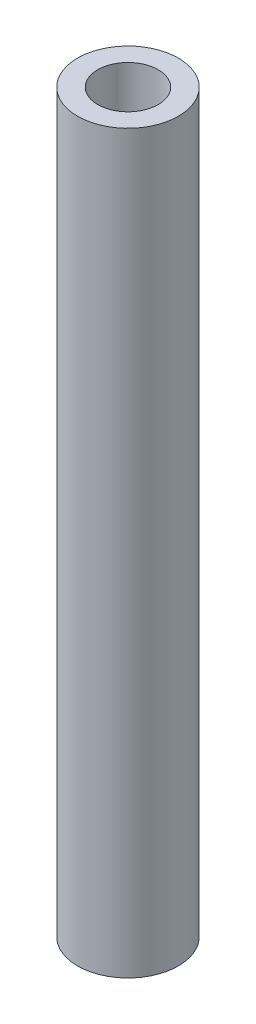
ISO-10303-21;
HEADER;
FILE_DESCRIPTION(('STEP AP214'),'2;1');
FILE_NAME('part.step','',(''),(''),'','','');
FILE_SCHEMA(('AUTOMOTIVE_DESIGN { 1 0 10303 214 1 1 1 1 }'));
ENDSEC;
DATA;
#1=APPLICATION_CONTEXT('core data for automotive mechanical design processes');
#2=APPLICATION_PROTOCOL_DEFINITION('international standard','automotive_design',2000,#1);
#3=PRODUCT_CONTEXT('',#1,'mechanical');
#4=PRODUCT('Part','Part','',(#3));
#5=PRODUCT_RELATED_PRODUCT_CATEGORY('part','',(#4));
#6=PRODUCT_DEFINITION_FORMATION('','',#4);
#7=PRODUCT_DEFINITION_CONTEXT('part definition',#1,'design');
#8=PRODUCT_DEFINITION('design','',#6,#7);
#9=PRODUCT_DEFINITION_SHAPE('','',#8);
#10=(LENGTH_UNIT() NAMED_UNIT(*) SI_UNIT(.MILLI.,.METRE.));
#11=(NAMED_UNIT(*) PLANE_ANGLE_UNIT() SI_UNIT($,.RADIAN.));
#12=(NAMED_UNIT(*) SI_UNIT($,.STERADIAN.) SOLID_ANGLE_UNIT());
#13=UNCERTAINTY_MEASURE_WITH_UNIT(LENGTH_MEASURE(1.E-05),#10,'distance_accuracy_value','');
#14=(GEOMETRIC_REPRESENTATION_CONTEXT(3) GLOBAL_UNCERTAINTY_ASSIGNED_CONTEXT((#13)) GLOBAL_UNIT_ASSIGNED_CONTEXT((#10,
#11,#12)) REPRESENTATION_CONTEXT('',''));
#15=CARTESIAN_POINT('',(0.,0.,0.));
#16=DIRECTION('',(0.,0.,1.));
#17=DIRECTION('',(1.,0.,0.));
#18=AXIS2_PLACEMENT_3D('',#15,#16,#17);
#19=CARTESIAN_POINT('',(0.,73.,0.));
#20=DIRECTION('',(0.,1.,0.));
#21=DIRECTION('',(0.,0.,1.));
#22=AXIS2_PLACEMENT_3D('',#19,#20,#21);
#23=PLANE('',#22);
#24=CARTESIAN_POINT('',(0.,73.,0.));
#25=DIRECTION('',(0.,1.,0.));
#26=DIRECTION('',(0.,0.,1.));
#27=AXIS2_PLACEMENT_3D('',#24,#25,#26);
#28=CIRCLE('',#27,5.);
#29=CARTESIAN_POINT('',(0.,73.,5.));
#30=VERTEX_POINT('',#29);
#31=EDGE_CURVE('E10',#30,#30,#28,.T.);
#32=ORIENTED_EDGE('',*,*,#31,.T.);
#33=EDGE_LOOP('',(#32));
#34=FACE_BOUND('',#33,.T.);
#35=CARTESIAN_POINT('',(0.,73.,0.));
#36=DIRECTION('',(0.,1.,0.));
#37=DIRECTION('',(0.,0.,1.));
#38=AXIS2_PLACEMENT_3D('',#35,#36,#37);
#39=CIRCLE('',#38,3.);
#40=CARTESIAN_POINT('',(0.,73.,3.));
#41=VERTEX_POINT('',#40);
#42=EDGE_CURVE('E39',#41,#41,#39,.T.);
#43=ORIENTED_EDGE('',*,*,#42,.F.);
#44=EDGE_LOOP('',(#43));
#45=FACE_BOUND('',#44,.T.);
#46=ADVANCED_FACE('F28',(#34,#45),#23,.T.);
#47=CARTESIAN_POINT('',(0.,0.,0.));
#48=DIRECTION('',(0.,1.,0.));
#49=DIRECTION('',(0.,0.,1.));
#50=AXIS2_PLACEMENT_3D('',#47,#48,#49);
#51=PLANE('',#50);
#52=CARTESIAN_POINT('',(0.,0.,0.));
#53=DIRECTION('',(0.,1.,0.));
#54=DIRECTION('',(0.,0.,1.));
#55=AXIS2_PLACEMENT_3D('',#52,#53,#54);
#56=CIRCLE('',#55,5.);
#57=CARTESIAN_POINT('',(0.,0.,5.));
#58=VERTEX_POINT('',#57);
#59=EDGE_CURVE('E32',#58,#58,#56,.T.);
#60=ORIENTED_EDGE('',*,*,#59,.F.);
#61=EDGE_LOOP('',(#60));
#62=FACE_BOUND('',#61,.T.);
#63=CARTESIAN_POINT('',(0.,0.,0.));
#64=DIRECTION('',(0.,1.,0.));
#65=DIRECTION('',(0.,0.,1.));
#66=AXIS2_PLACEMENT_3D('',#63,#64,#65);
#67=CIRCLE('',#66,3.);
#68=CARTESIAN_POINT('',(0.,0.,3.));
#69=VERTEX_POINT('',#68);
#70=EDGE_CURVE('E41',#69,#69,#67,.T.);
#71=ORIENTED_EDGE('',*,*,#70,.T.);
#72=EDGE_LOOP('',(#71));
#73=FACE_BOUND('',#72,.T.);
#74=ADVANCED_FACE('F51',(#62,#73),#51,.F.);
#75=CARTESIAN_POINT('',(0.,73.,0.));
#76=DIRECTION('',(0.,-1.,0.));
#77=DIRECTION('',(0.,0.,-1.));
#78=AXIS2_PLACEMENT_3D('',#75,#76,#77);
#79=CYLINDRICAL_SURFACE('',#78,5.);
#80=ORIENTED_EDGE('',*,*,#31,.F.);
#81=EDGE_LOOP('',(#80));
#82=FACE_BOUND('',#81,.T.);
#83=ORIENTED_EDGE('',*,*,#59,.T.);
#84=EDGE_LOOP('',(#83));
#85=FACE_BOUND('',#84,.T.);
#86=ADVANCED_FACE('F30',(#82,#85),#79,.T.);
#87=CARTESIAN_POINT('',(0.,73.,0.));
#88=DIRECTION('',(0.,-1.,0.));
#89=DIRECTION('',(0.,0.,-1.));
#90=AXIS2_PLACEMENT_3D('',#87,#88,#89);
#91=CYLINDRICAL_SURFACE('',#90,3.);
#92=ORIENTED_EDGE('',*,*,#42,.T.);
#93=EDGE_LOOP('',(#92));
#94=FACE_BOUND('',#93,.T.);
#95=ORIENTED_EDGE('',*,*,#70,.F.);
#96=EDGE_LOOP('',(#95));
#97=FACE_BOUND('',#96,.T.);
#98=ADVANCED_FACE('F47',(#94,#97),#91,.F.);
#99=CLOSED_SHELL('',(#46,#74,#86,#98));
#100=MANIFOLD_SOLID_BREP('B2',#99);
#101=ADVANCED_BREP_SHAPE_REPRESENTATION('',(#18,#100),#14);
#102=SHAPE_DEFINITION_REPRESENTATION(#9,#101);
ENDSEC;
END-ISO-10303-21;
